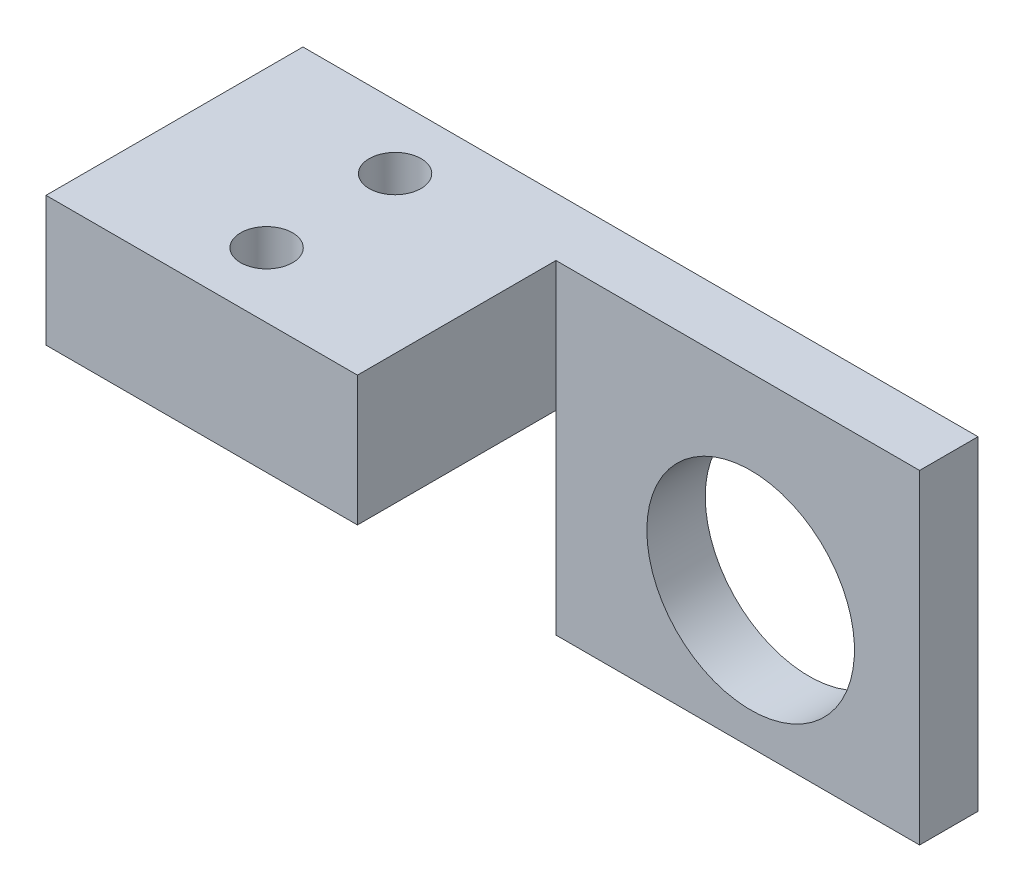
ISO-10303-21;
HEADER;
FILE_DESCRIPTION(('STEP AP214'),'2;1');
FILE_NAME('part.step','',(''),(''),'','','');
FILE_SCHEMA(('AUTOMOTIVE_DESIGN { 1 0 10303 214 1 1 1 1 }'));
ENDSEC;
DATA;
#1=APPLICATION_CONTEXT('core data for automotive mechanical design processes');
#2=APPLICATION_PROTOCOL_DEFINITION('international standard','automotive_design',2000,#1);
#3=PRODUCT_CONTEXT('',#1,'mechanical');
#4=PRODUCT('Part','Part','',(#3));
#5=PRODUCT_RELATED_PRODUCT_CATEGORY('part','',(#4));
#6=PRODUCT_DEFINITION_FORMATION('','',#4);
#7=PRODUCT_DEFINITION_CONTEXT('part definition',#1,'design');
#8=PRODUCT_DEFINITION('design','',#6,#7);
#9=PRODUCT_DEFINITION_SHAPE('','',#8);
#10=(LENGTH_UNIT() NAMED_UNIT(*) SI_UNIT(.MILLI.,.METRE.));
#11=(NAMED_UNIT(*) PLANE_ANGLE_UNIT() SI_UNIT($,.RADIAN.));
#12=(NAMED_UNIT(*) SI_UNIT($,.STERADIAN.) SOLID_ANGLE_UNIT());
#13=UNCERTAINTY_MEASURE_WITH_UNIT(LENGTH_MEASURE(1.E-05),#10,'distance_accuracy_value','');
#14=(GEOMETRIC_REPRESENTATION_CONTEXT(3) GLOBAL_UNCERTAINTY_ASSIGNED_CONTEXT((#13)) GLOBAL_UNIT_ASSIGNED_CONTEXT((#10,
#11,#12)) REPRESENTATION_CONTEXT('',''));
#15=CARTESIAN_POINT('',(0.,0.,0.));
#16=DIRECTION('',(0.,0.,1.));
#17=DIRECTION('',(1.,0.,0.));
#18=AXIS2_PLACEMENT_3D('',#15,#16,#17);
#19=CARTESIAN_POINT('',(0.,0.,4.8));
#20=DIRECTION('',(1.,0.,0.));
#21=DIRECTION('',(0.,1.,0.));
#22=AXIS2_PLACEMENT_3D('',#19,#20,#21);
#23=PLANE('',#22);
#24=DIRECTION('',(0.,0.,-1.));
#25=VECTOR('',#24,1.);
#26=CARTESIAN_POINT('',(0.,0.,4.8));
#27=LINE('',#26,#25);
#28=CARTESIAN_POINT('',(0.,0.,4.5));
#29=VERTEX_POINT('',#28);
#30=CARTESIAN_POINT('',(0.,0.,0.));
#31=VERTEX_POINT('',#30);
#32=EDGE_CURVE('E42',#29,#31,#27,.T.);
#33=ORIENTED_EDGE('',*,*,#32,.F.);
#34=DIRECTION('',(0.,1.,0.));
#35=VECTOR('',#34,1.);
#36=CARTESIAN_POINT('',(0.,-75.,4.5));
#37=LINE('',#36,#35);
#38=CARTESIAN_POINT('',(0.,15.,4.5));
#39=VERTEX_POINT('',#38);
#40=EDGE_CURVE('E178',#29,#39,#37,.T.);
#41=ORIENTED_EDGE('',*,*,#40,.T.);
#42=DIRECTION('',(0.,0.,-1.));
#43=VECTOR('',#42,1.);
#44=CARTESIAN_POINT('',(0.,15.,4.8));
#45=LINE('',#44,#43);
#46=CARTESIAN_POINT('',(0.,15.,0.));
#47=VERTEX_POINT('',#46);
#48=EDGE_CURVE('E49',#39,#47,#45,.T.);
#49=ORIENTED_EDGE('',*,*,#48,.T.);
#50=DIRECTION('',(0.,-1.,0.));
#51=VECTOR('',#50,1.);
#52=CARTESIAN_POINT('',(0.,0.,0.));
#53=LINE('',#52,#51);
#54=EDGE_CURVE('E134',#47,#31,#53,.T.);
#55=ORIENTED_EDGE('',*,*,#54,.T.);
#56=EDGE_LOOP('',(#33,#41,#49,#55));
#57=FACE_BOUND('',#56,.T.);
#58=ADVANCED_FACE('F35',(#57),#23,.F.);
#59=CARTESIAN_POINT('',(0.,0.,4.8));
#60=DIRECTION('',(0.,1.,0.));
#61=DIRECTION('',(-1.,0.,0.));
#62=AXIS2_PLACEMENT_3D('',#59,#60,#61);
#63=PLANE('',#62);
#64=DIRECTION('',(0.,0.,-1.));
#65=VECTOR('',#64,1.);
#66=CARTESIAN_POINT('',(28.0184548601934,0.,200.));
#67=LINE('',#66,#65);
#68=CARTESIAN_POINT('',(28.0184548601934,0.,4.5));
#69=VERTEX_POINT('',#68);
#70=CARTESIAN_POINT('',(28.0184548601934,0.,0.));
#71=VERTEX_POINT('',#70);
#72=EDGE_CURVE('E122',#69,#71,#67,.T.);
#73=ORIENTED_EDGE('',*,*,#72,.F.);
#74=DIRECTION('',(-1.,0.,0.));
#75=VECTOR('',#74,1.);
#76=CARTESIAN_POINT('',(0.,0.,4.5));
#77=LINE('',#76,#75);
#78=EDGE_CURVE('E105',#69,#29,#77,.T.);
#79=ORIENTED_EDGE('',*,*,#78,.T.);
#80=ORIENTED_EDGE('',*,*,#32,.T.);
#81=DIRECTION('',(1.,0.,0.));
#82=VECTOR('',#81,1.);
#83=CARTESIAN_POINT('',(0.,0.,0.));
#84=LINE('',#83,#82);
#85=EDGE_CURVE('E136',#31,#71,#84,.T.);
#86=ORIENTED_EDGE('',*,*,#85,.T.);
#87=EDGE_LOOP('',(#73,#79,#80,#86));
#88=FACE_BOUND('',#87,.T.);
#89=ADVANCED_FACE('F170',(#88),#63,.F.);
#90=CARTESIAN_POINT('',(-23.9999999999999,0.,4.8));
#91=DIRECTION('',(1.,0.,0.));
#92=DIRECTION('',(0.,1.,0.));
#93=AXIS2_PLACEMENT_3D('',#90,#91,#92);
#94=PLANE('',#93);
#95=DIRECTION('',(0.,0.,-1.));
#96=VECTOR('',#95,1.);
#97=CARTESIAN_POINT('',(-23.9999999999999,15.,4.8));
#98=LINE('',#97,#96);
#99=CARTESIAN_POINT('',(-24.,15.,19.8));
#100=VERTEX_POINT('',#99);
#101=CARTESIAN_POINT('',(-23.9999999999999,15.,0.));
#102=VERTEX_POINT('',#101);
#103=EDGE_CURVE('E146',#100,#102,#98,.T.);
#104=ORIENTED_EDGE('',*,*,#103,.F.);
#105=DIRECTION('',(0.,-1.,0.));
#106=VECTOR('',#105,1.);
#107=CARTESIAN_POINT('',(-24.,25.,19.8));
#108=LINE('',#107,#106);
#109=CARTESIAN_POINT('',(-24.,25.,19.8));
#110=VERTEX_POINT('',#109);
#111=EDGE_CURVE('E187',#110,#100,#108,.T.);
#112=ORIENTED_EDGE('',*,*,#111,.F.);
#113=DIRECTION('',(0.,0.,1.));
#114=VECTOR('',#113,1.);
#115=CARTESIAN_POINT('',(-24.,25.,-90.2));
#116=LINE('',#115,#114);
#117=CARTESIAN_POINT('',(-24.,25.,0.));
#118=VERTEX_POINT('',#117);
#119=EDGE_CURVE('E188',#118,#110,#116,.T.);
#120=ORIENTED_EDGE('',*,*,#119,.F.);
#121=DIRECTION('',(0.,-1.,0.));
#122=VECTOR('',#121,1.);
#123=CARTESIAN_POINT('',(-23.9999999999999,0.,0.));
#124=LINE('',#123,#122);
#125=EDGE_CURVE('E57',#118,#102,#124,.T.);
#126=ORIENTED_EDGE('',*,*,#125,.T.);
#127=EDGE_LOOP('',(#104,#112,#120,#126));
#128=FACE_BOUND('',#127,.T.);
#129=ADVANCED_FACE('F175',(#128),#94,.F.);
#130=CARTESIAN_POINT('',(0.,15.,4.8));
#131=DIRECTION('',(0.,1.,0.));
#132=DIRECTION('',(-1.,0.,0.));
#133=AXIS2_PLACEMENT_3D('',#130,#131,#132);
#134=PLANE('',#133);
#135=CARTESIAN_POINT('',(-12.,15.,14.8));
#136=DIRECTION('',(0.,1.,0.));
#137=DIRECTION('',(0.,0.,1.));
#138=AXIS2_PLACEMENT_3D('',#135,#136,#137);
#139=CIRCLE('',#138,2.);
#140=CARTESIAN_POINT('',(-12.,15.,16.8));
#141=VERTEX_POINT('',#140);
#142=EDGE_CURVE('E191',#141,#141,#139,.T.);
#143=ORIENTED_EDGE('',*,*,#142,.T.);
#144=EDGE_LOOP('',(#143));
#145=FACE_BOUND('',#144,.T.);
#146=CARTESIAN_POINT('',(-12.,15.,4.9));
#147=DIRECTION('',(0.,1.,0.));
#148=DIRECTION('',(-1.,0.,0.));
#149=AXIS2_PLACEMENT_3D('',#146,#147,#148);
#150=CIRCLE('',#149,2.);
#151=CARTESIAN_POINT('',(-14.,15.,4.9));
#152=VERTEX_POINT('',#151);
#153=EDGE_CURVE('E128',#152,#152,#150,.T.);
#154=ORIENTED_EDGE('',*,*,#153,.T.);
#155=EDGE_LOOP('',(#154));
#156=FACE_BOUND('',#155,.T.);
#157=DIRECTION('',(1.,0.,0.));
#158=VECTOR('',#157,1.);
#159=CARTESIAN_POINT('',(0.,15.,0.));
#160=LINE('',#159,#158);
#161=EDGE_CURVE('E139',#102,#47,#160,.T.);
#162=ORIENTED_EDGE('',*,*,#161,.T.);
#163=ORIENTED_EDGE('',*,*,#48,.F.);
#164=CARTESIAN_POINT('',(0.,15.,19.8));
#165=VERTEX_POINT('',#164);
#166=EDGE_CURVE('E144',#165,#39,#45,.T.);
#167=ORIENTED_EDGE('',*,*,#166,.F.);
#168=DIRECTION('',(1.,0.,0.));
#169=VECTOR('',#168,1.);
#170=CARTESIAN_POINT('',(-24.,15.,19.8));
#171=LINE('',#170,#169);
#172=EDGE_CURVE('E184',#100,#165,#171,.T.);
#173=ORIENTED_EDGE('',*,*,#172,.F.);
#174=ORIENTED_EDGE('',*,*,#103,.T.);
#175=EDGE_LOOP('',(#162,#163,#167,#173,#174));
#176=FACE_BOUND('',#175,.T.);
#177=ADVANCED_FACE('F151',(#145,#156,#176),#134,.F.);
#178=CARTESIAN_POINT('',(15.0000000000003,10.5,4.8));
#179=DIRECTION('',(0.,0.,-1.));
#180=DIRECTION('',(-1.,0.,0.));
#181=AXIS2_PLACEMENT_3D('',#178,#179,#180);
#182=CYLINDRICAL_SURFACE('',#181,8.);
#183=CARTESIAN_POINT('',(15.0000000000003,10.5,4.5));
#184=DIRECTION('',(0.,0.,-1.));
#185=DIRECTION('',(-1.,0.,0.));
#186=AXIS2_PLACEMENT_3D('',#183,#184,#185);
#187=CIRCLE('',#186,8.);
#188=CARTESIAN_POINT('',(7.00000000000033,10.5,4.5));
#189=VERTEX_POINT('',#188);
#190=EDGE_CURVE('E231',#189,#189,#187,.T.);
#191=ORIENTED_EDGE('',*,*,#190,.F.);
#192=EDGE_LOOP('',(#191));
#193=FACE_BOUND('',#192,.T.);
#194=CARTESIAN_POINT('',(15.0000000000003,10.5,0.));
#195=DIRECTION('',(0.,0.,1.00000000000002));
#196=DIRECTION('',(1.00000000000002,0.,0.));
#197=AXIS2_PLACEMENT_3D('',#194,#195,#196);
#198=CIRCLE('',#197,8.);
#199=CARTESIAN_POINT('',(23.0000000000005,10.5,0.));
#200=VERTEX_POINT('',#199);
#201=EDGE_CURVE('E141',#200,#200,#198,.T.);
#202=ORIENTED_EDGE('',*,*,#201,.F.);
#203=EDGE_LOOP('',(#202));
#204=FACE_BOUND('',#203,.T.);
#205=ADVANCED_FACE('F166',(#193,#204),#182,.F.);
#206=CARTESIAN_POINT('',(0.,0.,0.));
#207=DIRECTION('',(0.,0.,1.));
#208=DIRECTION('',(1.,0.,0.));
#209=AXIS2_PLACEMENT_3D('',#206,#207,#208);
#210=PLANE('',#209);
#211=ORIENTED_EDGE('',*,*,#125,.F.);
#212=DIRECTION('',(1.,0.,0.));
#213=VECTOR('',#212,1.);
#214=CARTESIAN_POINT('',(0.,25.,0.));
#215=LINE('',#214,#213);
#216=CARTESIAN_POINT('',(28.0184548601934,25.,0.));
#217=VERTEX_POINT('',#216);
#218=EDGE_CURVE('E126',#118,#217,#215,.T.);
#219=ORIENTED_EDGE('',*,*,#218,.T.);
#220=DIRECTION('',(0.,1.,0.));
#221=VECTOR('',#220,1.);
#222=CARTESIAN_POINT('',(28.0184548601934,102.7,0.));
#223=LINE('',#222,#221);
#224=EDGE_CURVE('E121',#71,#217,#223,.T.);
#225=ORIENTED_EDGE('',*,*,#224,.F.);
#226=ORIENTED_EDGE('',*,*,#85,.F.);
#227=ORIENTED_EDGE('',*,*,#54,.F.);
#228=ORIENTED_EDGE('',*,*,#161,.F.);
#229=EDGE_LOOP('',(#211,#219,#225,#226,#227,#228));
#230=FACE_BOUND('',#229,.T.);
#231=ORIENTED_EDGE('',*,*,#201,.T.);
#232=EDGE_LOOP('',(#231));
#233=FACE_BOUND('',#232,.T.);
#234=ADVANCED_FACE('F156',(#230,#233),#210,.F.);
#235=CARTESIAN_POINT('',(-12.0000000000001,0.,4.9));
#236=DIRECTION('',(0.,1.,0.));
#237=DIRECTION('',(-1.,0.,0.));
#238=AXIS2_PLACEMENT_3D('',#235,#236,#237);
#239=CYLINDRICAL_SURFACE('',#238,2.);
#240=CARTESIAN_POINT('',(-12.,25.,4.9));
#241=DIRECTION('',(0.,-1.,0.));
#242=DIRECTION('',(0.,0.,-1.));
#243=AXIS2_PLACEMENT_3D('',#240,#241,#242);
#244=CIRCLE('',#243,2.);
#245=CARTESIAN_POINT('',(-12.,25.,2.9));
#246=VERTEX_POINT('',#245);
#247=EDGE_CURVE('E130',#246,#246,#244,.F.);
#248=ORIENTED_EDGE('',*,*,#247,.T.);
#249=EDGE_LOOP('',(#248));
#250=FACE_BOUND('',#249,.T.);
#251=ORIENTED_EDGE('',*,*,#153,.F.);
#252=EDGE_LOOP('',(#251));
#253=FACE_BOUND('',#252,.T.);
#254=ADVANCED_FACE('F154',(#250,#253),#239,.F.);
#255=CARTESIAN_POINT('',(28.0184548601934,102.7,200.));
#256=DIRECTION('',(-1.,0.,0.));
#257=DIRECTION('',(0.,0.,1.));
#258=AXIS2_PLACEMENT_3D('',#255,#256,#257);
#259=PLANE('',#258);
#260=DIRECTION('',(0.,0.,1.));
#261=VECTOR('',#260,1.);
#262=CARTESIAN_POINT('',(28.0184548601934,25.,200.));
#263=LINE('',#262,#261);
#264=CARTESIAN_POINT('',(28.0184548601934,25.,4.5));
#265=VERTEX_POINT('',#264);
#266=EDGE_CURVE('E11',#217,#265,#263,.T.);
#267=ORIENTED_EDGE('',*,*,#266,.T.);
#268=DIRECTION('',(0.,1.,0.));
#269=VECTOR('',#268,1.);
#270=CARTESIAN_POINT('',(28.0184548601934,-75.,4.5));
#271=LINE('',#270,#269);
#272=EDGE_CURVE('E99',#69,#265,#271,.T.);
#273=ORIENTED_EDGE('',*,*,#272,.F.);
#274=ORIENTED_EDGE('',*,*,#72,.T.);
#275=ORIENTED_EDGE('',*,*,#224,.T.);
#276=EDGE_LOOP('',(#267,#273,#274,#275));
#277=FACE_BOUND('',#276,.T.);
#278=ADVANCED_FACE('F119',(#277),#259,.F.);
#279=CARTESIAN_POINT('',(-24.,25.,-90.2));
#280=DIRECTION('',(0.,-1.,0.));
#281=DIRECTION('',(0.,0.,-1.));
#282=AXIS2_PLACEMENT_3D('',#279,#280,#281);
#283=PLANE('',#282);
#284=CARTESIAN_POINT('',(-12.,25.,14.8));
#285=DIRECTION('',(0.,1.,0.));
#286=DIRECTION('',(0.,0.,1.));
#287=AXIS2_PLACEMENT_3D('',#284,#285,#286);
#288=CIRCLE('',#287,2.);
#289=CARTESIAN_POINT('',(-12.,25.,16.8));
#290=VERTEX_POINT('',#289);
#291=EDGE_CURVE('E196',#290,#290,#288,.T.);
#292=ORIENTED_EDGE('',*,*,#291,.F.);
#293=EDGE_LOOP('',(#292));
#294=FACE_BOUND('',#293,.T.);
#295=ORIENTED_EDGE('',*,*,#247,.F.);
#296=EDGE_LOOP('',(#295));
#297=FACE_BOUND('',#296,.T.);
#298=DIRECTION('',(0.,0.,-1.));
#299=VECTOR('',#298,1.);
#300=CARTESIAN_POINT('',(0.,25.,19.8));
#301=LINE('',#300,#299);
#302=CARTESIAN_POINT('',(0.,25.,19.8));
#303=VERTEX_POINT('',#302);
#304=CARTESIAN_POINT('',(0.,25.,4.5));
#305=VERTEX_POINT('',#304);
#306=EDGE_CURVE('E115',#303,#305,#301,.T.);
#307=ORIENTED_EDGE('',*,*,#306,.T.);
#308=DIRECTION('',(-1.,0.,0.));
#309=VECTOR('',#308,1.);
#310=CARTESIAN_POINT('',(0.,25.,4.5));
#311=LINE('',#310,#309);
#312=EDGE_CURVE('E103',#265,#305,#311,.T.);
#313=ORIENTED_EDGE('',*,*,#312,.F.);
#314=ORIENTED_EDGE('',*,*,#266,.F.);
#315=ORIENTED_EDGE('',*,*,#218,.F.);
#316=ORIENTED_EDGE('',*,*,#119,.T.);
#317=DIRECTION('',(-1.,0.,0.));
#318=VECTOR('',#317,1.);
#319=CARTESIAN_POINT('',(-24.,25.,19.8));
#320=LINE('',#319,#318);
#321=EDGE_CURVE('E201',#303,#110,#320,.T.);
#322=ORIENTED_EDGE('',*,*,#321,.F.);
#323=EDGE_LOOP('',(#307,#313,#314,#315,#316,#322));
#324=FACE_BOUND('',#323,.T.);
#325=ADVANCED_FACE('F111',(#294,#297,#324),#283,.F.);
#326=CARTESIAN_POINT('',(0.,25.,19.8));
#327=DIRECTION('',(-1.,0.,0.));
#328=DIRECTION('',(0.,0.,1.));
#329=AXIS2_PLACEMENT_3D('',#326,#327,#328);
#330=PLANE('',#329);
#331=DIRECTION('',(0.,1.,0.));
#332=VECTOR('',#331,1.);
#333=CARTESIAN_POINT('',(0.,25.,19.8));
#334=LINE('',#333,#332);
#335=EDGE_CURVE('E193',#165,#303,#334,.T.);
#336=ORIENTED_EDGE('',*,*,#335,.F.);
#337=ORIENTED_EDGE('',*,*,#166,.T.);
#338=EDGE_CURVE('E108',#39,#305,#37,.T.);
#339=ORIENTED_EDGE('',*,*,#338,.T.);
#340=ORIENTED_EDGE('',*,*,#306,.F.);
#341=EDGE_LOOP('',(#336,#337,#339,#340));
#342=FACE_BOUND('',#341,.T.);
#343=ADVANCED_FACE('F207',(#342),#330,.F.);
#344=CARTESIAN_POINT('',(0.,0.,19.8));
#345=DIRECTION('',(0.,0.,1.));
#346=DIRECTION('',(1.,0.,0.));
#347=AXIS2_PLACEMENT_3D('',#344,#345,#346);
#348=PLANE('',#347);
#349=ORIENTED_EDGE('',*,*,#111,.T.);
#350=ORIENTED_EDGE('',*,*,#172,.T.);
#351=ORIENTED_EDGE('',*,*,#335,.T.);
#352=ORIENTED_EDGE('',*,*,#321,.T.);
#353=EDGE_LOOP('',(#349,#350,#351,#352));
#354=FACE_BOUND('',#353,.T.);
#355=ADVANCED_FACE('F214',(#354),#348,.T.);
#356=CARTESIAN_POINT('',(-12.,15.,14.8));
#357=DIRECTION('',(0.,1.,0.));
#358=DIRECTION('',(0.,0.,1.));
#359=AXIS2_PLACEMENT_3D('',#356,#357,#358);
#360=CYLINDRICAL_SURFACE('',#359,2.);
#361=ORIENTED_EDGE('',*,*,#142,.F.);
#362=EDGE_LOOP('',(#361));
#363=FACE_BOUND('',#362,.T.);
#364=ORIENTED_EDGE('',*,*,#291,.T.);
#365=EDGE_LOOP('',(#364));
#366=FACE_BOUND('',#365,.T.);
#367=ADVANCED_FACE('F221',(#363,#366),#360,.F.);
#368=CARTESIAN_POINT('',(0.,-75.,4.5));
#369=DIRECTION('',(0.,0.,-1.));
#370=DIRECTION('',(-1.,0.,0.));
#371=AXIS2_PLACEMENT_3D('',#368,#369,#370);
#372=PLANE('',#371);
#373=ORIENTED_EDGE('',*,*,#190,.T.);
#374=EDGE_LOOP('',(#373));
#375=FACE_BOUND('',#374,.T.);
#376=ORIENTED_EDGE('',*,*,#272,.T.);
#377=ORIENTED_EDGE('',*,*,#312,.T.);
#378=ORIENTED_EDGE('',*,*,#338,.F.);
#379=ORIENTED_EDGE('',*,*,#40,.F.);
#380=ORIENTED_EDGE('',*,*,#78,.F.);
#381=EDGE_LOOP('',(#376,#377,#378,#379,#380));
#382=FACE_BOUND('',#381,.T.);
#383=ADVANCED_FACE('F101',(#375,#382),#372,.F.);
#384=CLOSED_SHELL('',(#58,#89,#129,#177,#205,#234,#254,#278,#325,#343,#355,#367,#383));
#385=MANIFOLD_SOLID_BREP('B2',#384);
#386=ADVANCED_BREP_SHAPE_REPRESENTATION('',(#18,#385),#14);
#387=SHAPE_DEFINITION_REPRESENTATION(#9,#386);
ENDSEC;
END-ISO-10303-21;
